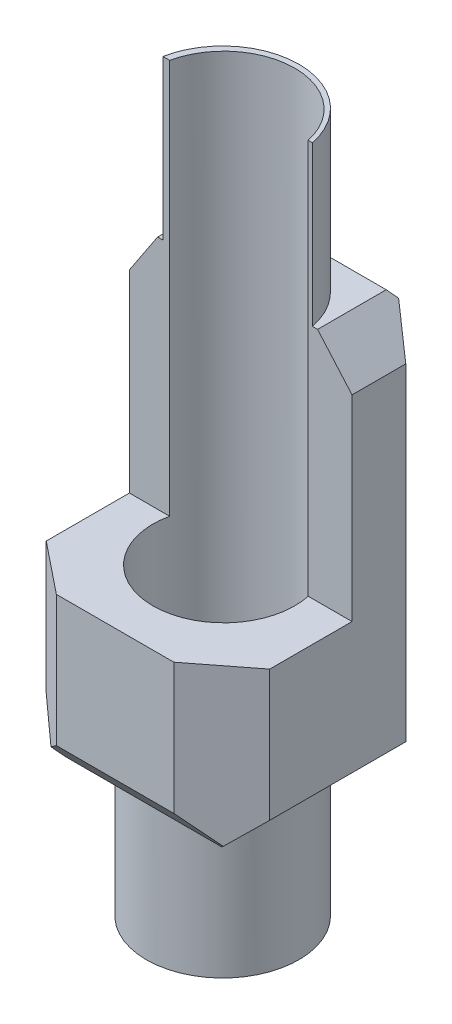
ISO-10303-21;
HEADER;
FILE_DESCRIPTION(('STEP AP214'),'2;1');
FILE_NAME('part.step','',(''),(''),'','','');
FILE_SCHEMA(('AUTOMOTIVE_DESIGN { 1 0 10303 214 1 1 1 1 }'));
ENDSEC;
DATA;
#1=APPLICATION_CONTEXT('core data for automotive mechanical design processes');
#2=APPLICATION_PROTOCOL_DEFINITION('international standard','automotive_design',2000,#1);
#3=PRODUCT_CONTEXT('',#1,'mechanical');
#4=PRODUCT('Part','Part','',(#3));
#5=PRODUCT_RELATED_PRODUCT_CATEGORY('part','',(#4));
#6=PRODUCT_DEFINITION_FORMATION('','',#4);
#7=PRODUCT_DEFINITION_CONTEXT('part definition',#1,'design');
#8=PRODUCT_DEFINITION('design','',#6,#7);
#9=PRODUCT_DEFINITION_SHAPE('','',#8);
#10=(LENGTH_UNIT() NAMED_UNIT(*) SI_UNIT(.MILLI.,.METRE.));
#11=(NAMED_UNIT(*) PLANE_ANGLE_UNIT() SI_UNIT($,.RADIAN.));
#12=(NAMED_UNIT(*) SI_UNIT($,.STERADIAN.) SOLID_ANGLE_UNIT());
#13=UNCERTAINTY_MEASURE_WITH_UNIT(LENGTH_MEASURE(1.E-05),#10,'distance_accuracy_value','');
#14=(GEOMETRIC_REPRESENTATION_CONTEXT(3) GLOBAL_UNCERTAINTY_ASSIGNED_CONTEXT((#13)) GLOBAL_UNIT_ASSIGNED_CONTEXT((#10,
#11,#12)) REPRESENTATION_CONTEXT('',''));
#15=CARTESIAN_POINT('',(0.,0.,0.));
#16=DIRECTION('',(0.,0.,1.));
#17=DIRECTION('',(1.,0.,0.));
#18=AXIS2_PLACEMENT_3D('',#15,#16,#17);
#19=CARTESIAN_POINT('',(0.,180.,0.));
#20=DIRECTION('',(-1.,0.,0.));
#21=DIRECTION('',(0.,0.,1.));
#22=AXIS2_PLACEMENT_3D('',#19,#20,#21);
#23=PLANE('',#22);
#24=DIRECTION('',(0.,0.,1.));
#25=VECTOR('',#24,1.);
#26=CARTESIAN_POINT('',(0.,162.25857257587,0.));
#27=LINE('',#26,#25);
#28=CARTESIAN_POINT('',(0.,162.25857257587,-79.942972796148));
#29=VERTEX_POINT('',#28);
#30=CARTESIAN_POINT('',(0.,162.25857257587,-55.8113966630778));
#31=VERTEX_POINT('',#30);
#32=EDGE_CURVE('E298',#29,#31,#27,.T.);
#33=ORIENTED_EDGE('',*,*,#32,.T.);
#34=DIRECTION('',(0.,-1.,0.));
#35=VECTOR('',#34,1.);
#36=CARTESIAN_POINT('',(0.,180.,-55.8113966630778));
#37=LINE('',#36,#35);
#38=CARTESIAN_POINT('',(0.,74.0838599725127,-55.8113966630778));
#39=VERTEX_POINT('',#38);
#40=EDGE_CURVE('E227',#31,#39,#37,.T.);
#41=ORIENTED_EDGE('',*,*,#40,.T.);
#42=DIRECTION('',(0.,0.,1.));
#43=VECTOR('',#42,1.);
#44=CARTESIAN_POINT('',(0.,74.0838599725127,0.));
#45=LINE('',#44,#43);
#46=CARTESIAN_POINT('',(0.,74.0838599725127,-18.835743686039));
#47=VERTEX_POINT('',#46);
#48=EDGE_CURVE('E211',#39,#47,#45,.T.);
#49=ORIENTED_EDGE('',*,*,#48,.T.);
#50=DIRECTION('',(0.,-1.,0.));
#51=VECTOR('',#50,1.);
#52=CARTESIAN_POINT('',(0.,180.,-18.835743686039));
#53=LINE('',#52,#51);
#54=CARTESIAN_POINT('',(0.,15.2573853040028,-18.835743686039));
#55=VERTEX_POINT('',#54);
#56=EDGE_CURVE('E263',#47,#55,#53,.T.);
#57=ORIENTED_EDGE('',*,*,#56,.T.);
#58=DIRECTION('',(0.,0.,1.));
#59=VECTOR('',#58,1.);
#60=CARTESIAN_POINT('',(0.,15.2573853040028,-400.));
#61=LINE('',#60,#59);
#62=CARTESIAN_POINT('',(0.,15.2573853040028,-79.942972796148));
#63=VERTEX_POINT('',#62);
#64=EDGE_CURVE('E284',#63,#55,#61,.T.);
#65=ORIENTED_EDGE('',*,*,#64,.F.);
#66=DIRECTION('',(0.,1.,0.));
#67=VECTOR('',#66,1.);
#68=CARTESIAN_POINT('',(0.,180.,-79.942972796148));
#69=LINE('',#68,#67);
#70=EDGE_CURVE('E248',#63,#29,#69,.T.);
#71=ORIENTED_EDGE('',*,*,#70,.T.);
#72=EDGE_LOOP('',(#33,#41,#49,#57,#65,#71));
#73=FACE_BOUND('',#72,.T.);
#74=ADVANCED_FACE('F33',(#73),#23,.F.);
#75=CARTESIAN_POINT('',(0.,180.,-100.));
#76=DIRECTION('',(0.,0.,1.));
#77=DIRECTION('',(1.,0.,0.));
#78=AXIS2_PLACEMENT_3D('',#75,#76,#77);
#79=PLANE('',#78);
#80=DIRECTION('',(-1.,0.,0.));
#81=VECTOR('',#80,1.);
#82=CARTESIAN_POINT('',(0.,11.2531638573118,-100.));
#83=LINE('',#82,#81);
#84=CARTESIAN_POINT('',(-26.8680350721203,11.2531638573118,-100.));
#85=VERTEX_POINT('',#84);
#86=CARTESIAN_POINT('',(-78.23623075056,11.2531638573118,-100.));
#87=VERTEX_POINT('',#86);
#88=EDGE_CURVE('E321',#85,#87,#83,.T.);
#89=ORIENTED_EDGE('',*,*,#88,.T.);
#90=DIRECTION('',(0.,1.,0.));
#91=VECTOR('',#90,1.);
#92=CARTESIAN_POINT('',(-78.23623075056,180.,-100.));
#93=LINE('',#92,#91);
#94=CARTESIAN_POINT('',(-78.23623075056,164.310416887307,-100.));
#95=VERTEX_POINT('',#94);
#96=EDGE_CURVE('E275',#87,#95,#93,.T.);
#97=ORIENTED_EDGE('',*,*,#96,.T.);
#98=DIRECTION('',(1.,0.,0.));
#99=VECTOR('',#98,1.);
#100=CARTESIAN_POINT('',(0.,164.310416887307,-100.));
#101=LINE('',#100,#99);
#102=CARTESIAN_POINT('',(-26.8680350721203,164.310416887307,-100.));
#103=VERTEX_POINT('',#102);
#104=EDGE_CURVE('E324',#95,#103,#101,.T.);
#105=ORIENTED_EDGE('',*,*,#104,.T.);
#106=DIRECTION('',(0.,-1.,0.));
#107=VECTOR('',#106,1.);
#108=CARTESIAN_POINT('',(-26.8680350721203,180.,-100.));
#109=LINE('',#108,#107);
#110=EDGE_CURVE('E244',#103,#85,#109,.T.);
#111=ORIENTED_EDGE('',*,*,#110,.T.);
#112=EDGE_LOOP('',(#89,#97,#105,#111));
#113=FACE_BOUND('',#112,.T.);
#114=ADVANCED_FACE('F425',(#113),#79,.F.);
#115=CARTESIAN_POINT('',(-100.,180.,0.));
#116=DIRECTION('',(1.,0.,0.));
#117=DIRECTION('',(0.,0.,-1.));
#118=AXIS2_PLACEMENT_3D('',#115,#116,#117);
#119=PLANE('',#118);
#120=DIRECTION('',(0.,0.,1.));
#121=VECTOR('',#120,1.);
#122=CARTESIAN_POINT('',(-100.,74.0838599725127,-55.8113966630778));
#123=LINE('',#122,#121);
#124=CARTESIAN_POINT('',(-100.,74.0838599725127,-55.8113966630778));
#125=VERTEX_POINT('',#124);
#126=CARTESIAN_POINT('',(-100.,74.0838599725127,-18.4618277268646));
#127=VERTEX_POINT('',#126);
#128=EDGE_CURVE('E190',#125,#127,#123,.T.);
#129=ORIENTED_EDGE('',*,*,#128,.F.);
#130=DIRECTION('',(0.,-1.,0.));
#131=VECTOR('',#130,1.);
#132=CARTESIAN_POINT('',(-100.,74.0838599725127,-55.8113966630778));
#133=LINE('',#132,#131);
#134=CARTESIAN_POINT('',(-100.,160.896793159201,-55.8113966630778));
#135=VERTEX_POINT('',#134);
#136=EDGE_CURVE('E181',#135,#125,#133,.T.);
#137=ORIENTED_EDGE('',*,*,#136,.F.);
#138=DIRECTION('',(0.,0.,-1.));
#139=VECTOR('',#138,1.);
#140=CARTESIAN_POINT('',(-100.,160.896793159201,0.));
#141=LINE('',#140,#139);
#142=CARTESIAN_POINT('',(-100.,160.896793159201,-80.507743362499));
#143=VERTEX_POINT('',#142);
#144=EDGE_CURVE('E309',#135,#143,#141,.T.);
#145=ORIENTED_EDGE('',*,*,#144,.T.);
#146=DIRECTION('',(0.,-1.,0.));
#147=VECTOR('',#146,1.);
#148=CARTESIAN_POINT('',(-100.,180.,-80.507743362499));
#149=LINE('',#148,#147);
#150=CARTESIAN_POINT('',(-100.,14.8474354345408,-80.507743362499));
#151=VERTEX_POINT('',#150);
#152=EDGE_CURVE('E272',#143,#151,#149,.T.);
#153=ORIENTED_EDGE('',*,*,#152,.T.);
#154=DIRECTION('',(0.,0.,1.));
#155=VECTOR('',#154,1.);
#156=CARTESIAN_POINT('',(-100.,14.8474354345408,0.));
#157=LINE('',#156,#155);
#158=CARTESIAN_POINT('',(-100.,14.8474354345408,-18.4618277268646));
#159=VERTEX_POINT('',#158);
#160=EDGE_CURVE('E311',#151,#159,#157,.T.);
#161=ORIENTED_EDGE('',*,*,#160,.T.);
#162=DIRECTION('',(0.,1.,0.));
#163=VECTOR('',#162,1.);
#164=CARTESIAN_POINT('',(-100.,180.,-18.4618277268646));
#165=LINE('',#164,#163);
#166=EDGE_CURVE('E200',#159,#127,#165,.T.);
#167=ORIENTED_EDGE('',*,*,#166,.T.);
#168=EDGE_LOOP('',(#129,#137,#145,#153,#161,#167));
#169=FACE_BOUND('',#168,.T.);
#170=ADVANCED_FACE('F198',(#169),#119,.F.);
#171=CARTESIAN_POINT('',(0.,180.,0.));
#172=DIRECTION('',(0.,0.,-1.));
#173=DIRECTION('',(-1.,0.,0.));
#174=AXIS2_PLACEMENT_3D('',#171,#172,#173);
#175=PLANE('',#174);
#176=DIRECTION('',(0.,1.,0.));
#177=VECTOR('',#176,1.);
#178=CARTESIAN_POINT('',(-24.2126205432622,180.,0.));
#179=LINE('',#178,#177);
#180=CARTESIAN_POINT('',(-24.2126205432622,15.2573853040028,0.));
#181=VERTEX_POINT('',#180);
#182=CARTESIAN_POINT('',(-24.2126205432622,74.0838599725127,0.));
#183=VERTEX_POINT('',#182);
#184=EDGE_CURVE('E260',#181,#183,#179,.T.);
#185=ORIENTED_EDGE('',*,*,#184,.T.);
#186=DIRECTION('',(-1.,0.,0.));
#187=VECTOR('',#186,1.);
#188=CARTESIAN_POINT('',(0.,74.0838599725127,0.));
#189=LINE('',#188,#187);
#190=CARTESIAN_POINT('',(-76.9899954986816,74.0838599725127,0.));
#191=VERTEX_POINT('',#190);
#192=EDGE_CURVE('E205',#183,#191,#189,.T.);
#193=ORIENTED_EDGE('',*,*,#192,.T.);
#194=DIRECTION('',(0.,-1.,0.));
#195=VECTOR('',#194,1.);
#196=CARTESIAN_POINT('',(-76.9899954986816,180.,0.));
#197=LINE('',#196,#195);
#198=CARTESIAN_POINT('',(-76.9899954986816,15.2573853040028,0.));
#199=VERTEX_POINT('',#198);
#200=EDGE_CURVE('E268',#191,#199,#197,.T.);
#201=ORIENTED_EDGE('',*,*,#200,.T.);
#202=DIRECTION('',(1.,0.,0.));
#203=VECTOR('',#202,1.);
#204=CARTESIAN_POINT('',(0.,15.2573853040028,0.));
#205=LINE('',#204,#203);
#206=EDGE_CURVE('E318',#199,#181,#205,.T.);
#207=ORIENTED_EDGE('',*,*,#206,.T.);
#208=EDGE_LOOP('',(#185,#193,#201,#207));
#209=FACE_BOUND('',#208,.T.);
#210=ADVANCED_FACE('F479',(#209),#175,.F.);
#211=CARTESIAN_POINT('',(0.,180.,0.));
#212=DIRECTION('',(0.,1.,0.));
#213=DIRECTION('',(0.,0.,1.));
#214=AXIS2_PLACEMENT_3D('',#211,#212,#213);
#215=PLANE('',#214);
#216=DIRECTION('',(-1.,0.,0.));
#217=VECTOR('',#216,1.);
#218=CARTESIAN_POINT('',(0.,180.,-55.8113966630778));
#219=LINE('',#218,#217);
#220=CARTESIAN_POINT('',(-15.4785584814981,180.,-55.8113966630778));
#221=VERTEX_POINT('',#220);
#222=CARTESIAN_POINT('',(-17.7880398883026,180.,-55.8113966630778));
#223=VERTEX_POINT('',#222);
#224=EDGE_CURVE('E221',#221,#223,#219,.T.);
#225=ORIENTED_EDGE('',*,*,#224,.F.);
#226=DIRECTION('',(0.,0.,1.));
#227=VECTOR('',#226,1.);
#228=CARTESIAN_POINT('',(-15.4785584814982,180.,0.));
#229=LINE('',#228,#227);
#230=CARTESIAN_POINT('',(-15.4785584814982,180.,-86.6502872632608));
#231=VERTEX_POINT('',#230);
#232=EDGE_CURVE('E295',#231,#221,#229,.T.);
#233=ORIENTED_EDGE('',*,*,#232,.F.);
#234=DIRECTION('',(1.,0.,0.));
#235=VECTOR('',#234,1.);
#236=CARTESIAN_POINT('',(0.,180.,-86.6502872632607));
#237=LINE('',#236,#235);
#238=CARTESIAN_POINT('',(-87.3310077399419,180.,-86.6502872632608));
#239=VERTEX_POINT('',#238);
#240=EDGE_CURVE('E339',#239,#231,#237,.T.);
#241=ORIENTED_EDGE('',*,*,#240,.F.);
#242=DIRECTION('',(0.,0.,-1.));
#243=VECTOR('',#242,1.);
#244=CARTESIAN_POINT('',(-87.3310077399419,180.,0.));
#245=LINE('',#244,#243);
#246=CARTESIAN_POINT('',(-87.3310077399419,180.,-55.8113966630778));
#247=VERTEX_POINT('',#246);
#248=EDGE_CURVE('E304',#247,#239,#245,.T.);
#249=ORIENTED_EDGE('',*,*,#248,.F.);
#250=CARTESIAN_POINT('',(-84.9665437781077,180.,-55.8113966630778));
#251=VERTEX_POINT('',#250);
#252=EDGE_CURVE('E224',#251,#247,#219,.T.);
#253=ORIENTED_EDGE('',*,*,#252,.F.);
#254=CARTESIAN_POINT('',(-51.3772918332052,180.,-49.0765363844359));
#255=DIRECTION('',(0.,1.,0.));
#256=DIRECTION('',(0.,0.,1.));
#257=AXIS2_PLACEMENT_3D('',#254,#255,#256);
#258=CIRCLE('',#257,34.2577901971357);
#259=EDGE_CURVE('E327',#251,#223,#258,.F.);
#260=ORIENTED_EDGE('',*,*,#259,.T.);
#261=EDGE_LOOP('',(#225,#233,#241,#249,#253,#260));
#262=FACE_BOUND('',#261,.T.);
#263=ADVANCED_FACE('F381',(#262),#215,.T.);
#264=CARTESIAN_POINT('',(0.,0.,0.));
#265=DIRECTION('',(0.,1.,0.));
#266=DIRECTION('',(0.,0.,1.));
#267=AXIS2_PLACEMENT_3D('',#264,#265,#266);
#268=PLANE('',#267);
#269=DIRECTION('',(1.,0.,0.));
#270=VECTOR('',#269,1.);
#271=CARTESIAN_POINT('',(0.,0.,-86.7744382892866));
#272=LINE('',#271,#270);
#273=CARTESIAN_POINT('',(-85.6232873351068,0.,-86.7744382892867));
#274=VERTEX_POINT('',#273);
#275=CARTESIAN_POINT('',(-15.6949887514202,0.,-86.7744382892866));
#276=VERTEX_POINT('',#275);
#277=EDGE_CURVE('E336',#274,#276,#272,.T.);
#278=ORIENTED_EDGE('',*,*,#277,.T.);
#279=DIRECTION('',(0.,0.,1.));
#280=VECTOR('',#279,1.);
#281=CARTESIAN_POINT('',(-15.6949887514202,0.,-400.));
#282=LINE('',#281,#280);
#283=CARTESIAN_POINT('',(-15.6949887514202,0.,-12.9819708694115));
#284=VERTEX_POINT('',#283);
#285=EDGE_CURVE('E285',#276,#284,#282,.T.);
#286=ORIENTED_EDGE('',*,*,#285,.T.);
#287=DIRECTION('',(-1.,0.,0.));
#288=VECTOR('',#287,1.);
#289=CARTESIAN_POINT('',(0.,0.,-12.9819708694114));
#290=LINE('',#289,#288);
#291=CARTESIAN_POINT('',(-85.6232873351069,0.,-12.9819708694114));
#292=VERTEX_POINT('',#291);
#293=EDGE_CURVE('E333',#284,#292,#290,.T.);
#294=ORIENTED_EDGE('',*,*,#293,.T.);
#295=DIRECTION('',(0.,0.,1.));
#296=VECTOR('',#295,1.);
#297=CARTESIAN_POINT('',(-85.6232873351068,0.,-400.));
#298=LINE('',#297,#296);
#299=CARTESIAN_POINT('',(-85.6232873351068,0.,-48.1776585981388));
#300=VERTEX_POINT('',#299);
#301=EDGE_CURVE('E288',#300,#292,#298,.T.);
#302=ORIENTED_EDGE('',*,*,#301,.F.);
#303=CARTESIAN_POINT('',(-51.3772918332052,0.,-49.0765363844359));
#304=DIRECTION('',(0.,1.,0.));
#305=DIRECTION('',(0.,0.,1.));
#306=AXIS2_PLACEMENT_3D('',#303,#304,#305);
#307=CIRCLE('',#306,34.2577901971357);
#308=CARTESIAN_POINT('',(-85.6232873351068,0.,-49.9754141707329));
#309=VERTEX_POINT('',#308);
#310=EDGE_CURVE('E330',#309,#300,#307,.F.);
#311=ORIENTED_EDGE('',*,*,#310,.F.);
#312=EDGE_CURVE('E294',#274,#309,#298,.T.);
#313=ORIENTED_EDGE('',*,*,#312,.F.);
#314=EDGE_LOOP('',(#278,#286,#294,#302,#311,#313));
#315=FACE_BOUND('',#314,.T.);
#316=ADVANCED_FACE('F402',(#315),#268,.F.);
#317=CARTESIAN_POINT('',(-51.3772918332052,530.,-49.0765363844359));
#318=DIRECTION('',(0.,-1.,0.));
#319=DIRECTION('',(0.,0.,-1.));
#320=AXIS2_PLACEMENT_3D('',#317,#318,#319);
#321=CYLINDRICAL_SURFACE('',#320,34.2577901971357);
#322=CARTESIAN_POINT('',(-51.3772918332052,-62.6813888831705,-49.0765363844359));
#323=DIRECTION('',(0.,1.,0.));
#324=DIRECTION('',(0.,0.,1.));
#325=AXIS2_PLACEMENT_3D('',#322,#323,#324);
#326=CIRCLE('',#325,34.2577901971357);
#327=CARTESIAN_POINT('',(-51.3772918332052,-62.6813888831705,-14.8187461873002));
#328=VERTEX_POINT('',#327);
#329=EDGE_CURVE('E245',#328,#328,#326,.T.);
#330=ORIENTED_EDGE('',*,*,#329,.T.);
#331=EDGE_LOOP('',(#330));
#332=FACE_BOUND('',#331,.T.);
#333=ORIENTED_EDGE('',*,*,#310,.T.);
#334=CARTESIAN_POINT('',(-51.3772918332052,86.1655593743765,-49.0765363844359));
#335=DIRECTION('',(0.929293452580676,-0.369342224760028,0.));
#336=DIRECTION('',(-0.369342224760028,-0.929293452580676,0.));
#337=AXIS2_PLACEMENT_3D('',#334,#335,#336);
#338=ELLIPSE('',#337,92.7535166589576,34.2577901971357);
#339=EDGE_CURVE('E347',#300,#309,#338,.T.);
#340=ORIENTED_EDGE('',*,*,#339,.T.);
#341=EDGE_LOOP('',(#333,#340));
#342=FACE_BOUND('',#341,.T.);
#343=ADVANCED_FACE('F410',(#332,#342),#321,.T.);
#344=CARTESIAN_POINT('',(-51.3772918332052,251.428834106385,-49.0765363844359));
#345=DIRECTION('',(0.,-1.,0.));
#346=DIRECTION('',(0.,0.,-1.));
#347=AXIS2_PLACEMENT_3D('',#344,#345,#346);
#348=CIRCLE('',#347,34.2577901971357);
#349=CARTESIAN_POINT('',(-84.9665437781077,251.428834106385,-55.8113966630778));
#350=VERTEX_POINT('',#349);
#351=CARTESIAN_POINT('',(-17.7880398883026,251.428834106385,-55.8113966630778));
#352=VERTEX_POINT('',#351);
#353=EDGE_CURVE('E240',#350,#352,#348,.T.);
#354=ORIENTED_EDGE('',*,*,#353,.T.);
#355=DIRECTION('',(0.,-1.,0.));
#356=VECTOR('',#355,1.);
#357=CARTESIAN_POINT('',(-17.7880398883026,530.,-55.8113966630778));
#358=LINE('',#357,#356);
#359=EDGE_CURVE('E217',#352,#223,#358,.T.);
#360=ORIENTED_EDGE('',*,*,#359,.T.);
#361=ORIENTED_EDGE('',*,*,#259,.F.);
#362=DIRECTION('',(0.,-1.,0.));
#363=VECTOR('',#362,1.);
#364=CARTESIAN_POINT('',(-84.9665437781077,530.,-55.8113966630778));
#365=LINE('',#364,#363);
#366=EDGE_CURVE('E230',#251,#350,#365,.F.);
#367=ORIENTED_EDGE('',*,*,#366,.T.);
#368=EDGE_LOOP('',(#354,#360,#361,#367));
#369=FACE_BOUND('',#368,.T.);
#370=ADVANCED_FACE('F378',(#369),#321,.T.);
#371=CARTESIAN_POINT('',(-400.,0.,-12.9819708694114));
#372=DIRECTION('',(0.,0.648030679802751,-0.761614231769854));
#373=DIRECTION('',(0.,0.761614231769854,0.648030679802751));
#374=AXIS2_PLACEMENT_3D('',#371,#372,#373);
#375=PLANE('',#374);
#376=DIRECTION('',(0.61672298954482,0.599527685323787,0.51011695590051));
#377=VECTOR('',#376,1.);
#378=CARTESIAN_POINT('',(-161.864341339676,-142.093898084117,-133.884655627931));
#379=LINE('',#378,#377);
#380=CARTESIAN_POINT('',(-11.7351397334046,3.84944157466014,-9.70661684314665));
#381=VERTEX_POINT('',#380);
#382=EDGE_CURVE('E315',#284,#381,#379,.T.);
#383=ORIENTED_EDGE('',*,*,#382,.T.);
#384=DIRECTION('',(-0.640041580283072,0.585178886954522,0.49790806959861));
#385=VECTOR('',#384,1.);
#386=CARTESIAN_POINT('',(-168.303530456469,146.997198592356,112.092759301453));
#387=LINE('',#386,#385);
#388=EDGE_CURVE('E257',#381,#181,#387,.T.);
#389=ORIENTED_EDGE('',*,*,#388,.T.);
#390=ORIENTED_EDGE('',*,*,#206,.F.);
#391=DIRECTION('',(-0.628329778342481,-0.592495582556801,-0.504133587751069));
#392=VECTOR('',#391,1.);
#393=CARTESIAN_POINT('',(-214.306055792962,-114.227420195886,-110.174052731693));
#394=LINE('',#393,#392);
#395=CARTESIAN_POINT('',(-89.2252600270588,3.71990859296577,-9.81683188730251));
#396=VERTEX_POINT('',#395);
#397=EDGE_CURVE('E265',#199,#396,#394,.T.);
#398=ORIENTED_EDGE('',*,*,#397,.T.);
#399=DIRECTION('',(0.593525479967305,-0.612958709544806,-0.521544940559053));
#400=VECTOR('',#399,1.);
#401=CARTESIAN_POINT('',(-196.369556391918,114.372326815193,84.3334069228837));
#402=LINE('',#401,#400);
#403=EDGE_CURVE('E313',#396,#292,#402,.T.);
#404=ORIENTED_EDGE('',*,*,#403,.T.);
#405=ORIENTED_EDGE('',*,*,#293,.F.);
#406=EDGE_LOOP('',(#383,#389,#390,#398,#404,#405));
#407=FACE_BOUND('',#406,.T.);
#408=ADVANCED_FACE('F477',(#407),#375,.F.);
#409=CARTESIAN_POINT('',(-400.,-1.44810398413053,-85.072517936176));
#410=DIRECTION('',(0.,0.761614231769854,0.648030679802751));
#411=DIRECTION('',(0.,-0.648030679802751,0.761614231769854));
#412=AXIS2_PLACEMENT_3D('',#409,#410,#411);
#413=PLANE('',#412);
#414=DIRECTION('',(-0.531512068777104,0.548914853332077,-0.645125882704847));
#415=VECTOR('',#414,1.);
#416=CARTESIAN_POINT('',(-173.430238872661,90.6819294539596,-193.350639369007));
#417=LINE('',#416,#415);
#418=CARTESIAN_POINT('',(-88.756666543567,3.23597240717974,-90.5775956331223));
#419=VERTEX_POINT('',#418);
#420=EDGE_CURVE('E342',#274,#419,#417,.T.);
#421=ORIENTED_EDGE('',*,*,#420,.T.);
#422=DIRECTION('',(0.647811274519912,0.49367033016184,-0.580198377904305));
#423=VECTOR('',#422,1.);
#424=CARTESIAN_POINT('',(-222.939997158503,-99.0196253762684,29.6008480382685));
#425=LINE('',#424,#423);
#426=EDGE_CURVE('E55',#419,#87,#425,.T.);
#427=ORIENTED_EDGE('',*,*,#426,.T.);
#428=ORIENTED_EDGE('',*,*,#88,.F.);
#429=DIRECTION('',(0.71415681894842,-0.453612235752694,0.533119102569883));
#430=VECTOR('',#429,1.);
#431=CARTESIAN_POINT('',(-207.374856665364,125.905997435364,-234.7486044833));
#432=LINE('',#431,#430);
#433=CARTESIAN_POINT('',(-13.109045681771,2.51384250175289,-89.7288944368655));
#434=VERTEX_POINT('',#433);
#435=EDGE_CURVE('E241',#85,#434,#432,.T.);
#436=ORIENTED_EDGE('',*,*,#435,.T.);
#437=DIRECTION('',(-0.554671653885714,-0.539206448286052,0.633715837345437));
#438=VECTOR('',#437,1.);
#439=CARTESIAN_POINT('',(-134.961850638957,-115.941495380351,49.48869814313));
#440=LINE('',#439,#438);
#441=EDGE_CURVE('E345',#434,#276,#440,.T.);
#442=ORIENTED_EDGE('',*,*,#441,.T.);
#443=ORIENTED_EDGE('',*,*,#277,.F.);
#444=EDGE_LOOP('',(#421,#427,#428,#436,#442,#443));
#445=FACE_BOUND('',#444,.T.);
#446=ADVANCED_FACE('F397',(#445),#413,.F.);
#447=CARTESIAN_POINT('',(-400.,181.854312783962,-85.072517936176));
#448=DIRECTION('',(0.,-0.648030679802751,0.761614231769854));
#449=DIRECTION('',(0.,-0.761614231769854,-0.648030679802751));
#450=AXIS2_PLACEMENT_3D('',#447,#448,#449);
#451=PLANE('',#450);
#452=ORIENTED_EDGE('',*,*,#104,.F.);
#453=DIRECTION('',(-0.586196421620691,0.617036215494435,0.52501434651579));
#454=VECTOR('',#453,1.);
#455=CARTESIAN_POINT('',(-199.742515919054,292.209147745934,8.82451777669856));
#456=LINE('',#455,#454);
#457=CARTESIAN_POINT('',(-89.7197502262504,176.398084325205,-89.7150302341283));
#458=VERTEX_POINT('',#457);
#459=EDGE_CURVE('E281',#95,#458,#456,.T.);
#460=ORIENTED_EDGE('',*,*,#459,.T.);
#461=DIRECTION('',(0.450846295048029,0.679818082679197,0.578433222337588));
#462=VECTOR('',#461,1.);
#463=CARTESIAN_POINT('',(-149.905059314496,85.6463982645104,-166.932438152694));
#464=LINE('',#463,#462);
#465=EDGE_CURVE('E306',#458,#239,#464,.T.);
#466=ORIENTED_EDGE('',*,*,#465,.T.);
#467=ORIENTED_EDGE('',*,*,#240,.T.);
#468=DIRECTION('',(0.553434352005852,-0.634343010808712,-0.539740088059059));
#469=VECTOR('',#468,1.);
#470=CARTESIAN_POINT('',(-134.375755077368,316.279226961578,29.3048989806743));
#471=LINE('',#470,#469);
#472=CARTESIAN_POINT('',(-12.6631489460901,176.772995107952,-89.3960318760697));
#473=VERTEX_POINT('',#472);
#474=EDGE_CURVE('E301',#231,#473,#471,.T.);
#475=ORIENTED_EDGE('',*,*,#474,.T.);
#476=DIRECTION('',(-0.655544261905661,-0.575138129838513,-0.489364743609938));
#477=VECTOR('',#476,1.);
#478=CARTESIAN_POINT('',(-175.813834897368,33.6336438044814,-211.188255894991));
#479=LINE('',#478,#477);
#480=EDGE_CURVE('E254',#473,#103,#479,.T.);
#481=ORIENTED_EDGE('',*,*,#480,.T.);
#482=EDGE_LOOP('',(#452,#460,#466,#467,#475,#481));
#483=FACE_BOUND('',#482,.T.);
#484=ADVANCED_FACE('F468',(#483),#451,.F.);
#485=CARTESIAN_POINT('',(-15.6949887514202,180.248071028759,-400.));
#486=DIRECTION('',(-0.753527099389569,-0.657416846822123,0.));
#487=DIRECTION('',(0.657416846822123,-0.753527099389569,0.));
#488=AXIS2_PLACEMENT_3D('',#485,#486,#487);
#489=PLANE('',#488);
#490=ORIENTED_EDGE('',*,*,#232,.T.);
#491=DIRECTION('',(0.657416846822123,-0.753527099389569,0.));
#492=VECTOR('',#491,1.);
#493=CARTESIAN_POINT('',(-15.6949887514202,180.248071028759,-55.8113966630778));
#494=LINE('',#493,#492);
#495=EDGE_CURVE('E223',#221,#31,#494,.T.);
#496=ORIENTED_EDGE('',*,*,#495,.T.);
#497=ORIENTED_EDGE('',*,*,#32,.F.);
#498=DIRECTION('',(-0.590175998555204,0.676456057477596,-0.440567240079464));
#499=VECTOR('',#498,1.);
#500=CARTESIAN_POINT('',(-95.8673346312649,272.14111504508,-151.508077333892));
#501=LINE('',#500,#499);
#502=EDGE_CURVE('E251',#29,#473,#501,.T.);
#503=ORIENTED_EDGE('',*,*,#502,.T.);
#504=ORIENTED_EDGE('',*,*,#474,.F.);
#505=EDGE_LOOP('',(#490,#496,#497,#503,#504));
#506=FACE_BOUND('',#505,.T.);
#507=ADVANCED_FACE('F421',(#506),#489,.F.);
#508=CARTESIAN_POINT('',(-87.166490338781,180.248071028759,-400.));
#509=DIRECTION('',(0.833386414729428,-0.552690766834791,0.));
#510=DIRECTION('',(0.552690766834791,0.833386414729428,0.));
#511=AXIS2_PLACEMENT_3D('',#508,#509,#510);
#512=PLANE('',#511);
#513=ORIENTED_EDGE('',*,*,#144,.F.);
#514=DIRECTION('',(0.552690766834791,0.833386414729428,0.));
#515=VECTOR('',#514,1.);
#516=CARTESIAN_POINT('',(-87.166490338781,180.248071028759,-55.8113966630778));
#517=LINE('',#516,#515);
#518=EDGE_CURVE('E186',#135,#247,#517,.T.);
#519=ORIENTED_EDGE('',*,*,#518,.T.);
#520=ORIENTED_EDGE('',*,*,#248,.T.);
#521=ORIENTED_EDGE('',*,*,#465,.F.);
#522=DIRECTION('',(-0.495327209718188,-0.746889566816963,0.443629271230791));
#523=VECTOR('',#522,1.);
#524=CARTESIAN_POINT('',(-19.4864586420873,282.300832444514,-152.617982767967));
#525=LINE('',#524,#523);
#526=EDGE_CURVE('E278',#458,#143,#525,.T.);
#527=ORIENTED_EDGE('',*,*,#526,.T.);
#528=EDGE_LOOP('',(#513,#519,#520,#521,#527));
#529=FACE_BOUND('',#528,.T.);
#530=ADVANCED_FACE('F386',(#529),#512,.F.);
#531=CARTESIAN_POINT('',(-93.5263452614059,-19.8847017587749,-400.));
#532=DIRECTION('',(0.929293452580676,-0.369342224760028,0.));
#533=DIRECTION('',(0.369342224760028,0.929293452580676,0.));
#534=AXIS2_PLACEMENT_3D('',#531,#532,#533);
#535=PLANE('',#534);
#536=EDGE_CURVE('E293',#309,#300,#298,.T.);
#537=ORIENTED_EDGE('',*,*,#536,.F.);
#538=ORIENTED_EDGE('',*,*,#339,.F.);
#539=EDGE_LOOP('',(#537,#538));
#540=FACE_BOUND('',#539,.T.);
#541=ADVANCED_FACE('F411',(#540),#535,.F.);
#542=CARTESIAN_POINT('',(-85.6232873351068,0.,-400.));
#543=DIRECTION('',(0.718403190633828,0.695626951524404,0.));
#544=DIRECTION('',(-0.695626951524404,0.718403190633828,0.));
#545=AXIS2_PLACEMENT_3D('',#542,#543,#544);
#546=PLANE('',#545);
#547=ORIENTED_EDGE('',*,*,#160,.F.);
#548=DIRECTION('',(0.590414359571925,-0.609745724749451,-0.528792052853521));
#549=VECTOR('',#548,1.);
#550=CARTESIAN_POINT('',(10.1042154435278,-98.861815628153,-179.120240108721));
#551=LINE('',#550,#549);
#552=EDGE_CURVE('E359',#151,#419,#551,.T.);
#553=ORIENTED_EDGE('',*,*,#552,.T.);
#554=ORIENTED_EDGE('',*,*,#420,.F.);
#555=ORIENTED_EDGE('',*,*,#312,.T.);
#556=ORIENTED_EDGE('',*,*,#536,.T.);
#557=ORIENTED_EDGE('',*,*,#301,.T.);
#558=ORIENTED_EDGE('',*,*,#403,.F.);
#559=DIRECTION('',(-0.60742264461239,0.627310895583479,-0.487358975596371));
#560=VECTOR('',#559,1.);
#561=CARTESIAN_POINT('',(-201.985869600553,120.172529524189,-100.289084867645));
#562=LINE('',#561,#560);
#563=EDGE_CURVE('E356',#396,#159,#562,.T.);
#564=ORIENTED_EDGE('',*,*,#563,.T.);
#565=EDGE_LOOP('',(#547,#553,#554,#555,#556,#557,#558,#564));
#566=FACE_BOUND('',#565,.T.);
#567=ADVANCED_FACE('F392',(#566),#546,.F.);
#568=CARTESIAN_POINT('',(-15.6949887514202,0.,-400.));
#569=DIRECTION('',(-0.697040073938311,0.717032171749687,0.));
#570=DIRECTION('',(-0.717032171749687,-0.697040073938311,0.));
#571=AXIS2_PLACEMENT_3D('',#568,#569,#570);
#572=PLANE('',#571);
#573=ORIENTED_EDGE('',*,*,#64,.T.);
#574=DIRECTION('',(-0.626200927331214,-0.608741361802611,0.487140999137037));
#575=VECTOR('',#574,1.);
#576=CARTESIAN_POINT('',(104.302981271785,116.652218955974,-99.9762471443389));
#577=LINE('',#576,#575);
#578=EDGE_CURVE('E353',#55,#381,#577,.T.);
#579=ORIENTED_EDGE('',*,*,#578,.T.);
#580=ORIENTED_EDGE('',*,*,#382,.F.);
#581=ORIENTED_EDGE('',*,*,#285,.F.);
#582=ORIENTED_EDGE('',*,*,#441,.F.);
#583=DIRECTION('',(0.63216753808039,0.614541613118557,0.471913985322559));
#584=VECTOR('',#583,1.);
#585=CARTESIAN_POINT('',(-107.681868244315,-89.4221261043572,-160.32764383519));
#586=LINE('',#585,#584);
#587=EDGE_CURVE('E350',#434,#63,#586,.T.);
#588=ORIENTED_EDGE('',*,*,#587,.T.);
#589=EDGE_LOOP('',(#573,#579,#580,#581,#582,#588));
#590=FACE_BOUND('',#589,.T.);
#591=ADVANCED_FACE('F418',(#590),#572,.F.);
#592=CARTESIAN_POINT('',(-31.7243853522426,-220.,-103.625272537362));
#593=DIRECTION('',(-0.598204225918444,0.,0.801343686624731));
#594=DIRECTION('',(0.801343686624731,0.,0.598204225918444));
#595=AXIS2_PLACEMENT_3D('',#592,#593,#594);
#596=PLANE('',#595);
#597=ORIENTED_EDGE('',*,*,#502,.F.);
#598=ORIENTED_EDGE('',*,*,#70,.F.);
#599=ORIENTED_EDGE('',*,*,#587,.F.);
#600=ORIENTED_EDGE('',*,*,#435,.F.);
#601=ORIENTED_EDGE('',*,*,#110,.F.);
#602=ORIENTED_EDGE('',*,*,#480,.F.);
#603=EDGE_LOOP('',(#597,#598,#599,#600,#601,#602));
#604=FACE_BOUND('',#603,.T.);
#605=ADVANCED_FACE('F452',(#604),#596,.F.);
#606=CARTESIAN_POINT('',(-38.5315768457559,-220.,11.1391573780071));
#607=DIRECTION('',(-0.614015874090284,0.,-0.789293675614561));
#608=DIRECTION('',(-0.789293675614561,0.,0.614015874090284));
#609=AXIS2_PLACEMENT_3D('',#606,#607,#608);
#610=PLANE('',#609);
#611=ORIENTED_EDGE('',*,*,#56,.F.);
#612=DIRECTION('',(-0.789293675614561,0.,0.614015874090284));
#613=VECTOR('',#612,1.);
#614=CARTESIAN_POINT('',(-38.5315768457559,74.0838599725127,11.1391573780071));
#615=LINE('',#614,#613);
#616=EDGE_CURVE('E208',#47,#183,#615,.T.);
#617=ORIENTED_EDGE('',*,*,#616,.T.);
#618=ORIENTED_EDGE('',*,*,#184,.F.);
#619=ORIENTED_EDGE('',*,*,#388,.F.);
#620=ORIENTED_EDGE('',*,*,#578,.F.);
#621=EDGE_LOOP('',(#611,#617,#618,#619,#620));
#622=FACE_BOUND('',#621,.T.);
#623=ADVANCED_FACE('F455',(#622),#610,.F.);
#624=CARTESIAN_POINT('',(-112.386997555001,-220.,-28.4004009635807));
#625=DIRECTION('',(0.625806910437033,0.,-0.779978019465456));
#626=DIRECTION('',(-0.779978019465456,0.,-0.625806910437033));
#627=AXIS2_PLACEMENT_3D('',#624,#625,#626);
#628=PLANE('',#627);
#629=ORIENTED_EDGE('',*,*,#200,.F.);
#630=DIRECTION('',(-0.779978019465456,0.,-0.625806910437033));
#631=VECTOR('',#630,1.);
#632=CARTESIAN_POINT('',(-112.386997555001,74.0838599725127,-28.4004009635807));
#633=LINE('',#632,#631);
#634=EDGE_CURVE('E203',#191,#127,#633,.T.);
#635=ORIENTED_EDGE('',*,*,#634,.T.);
#636=ORIENTED_EDGE('',*,*,#166,.F.);
#637=ORIENTED_EDGE('',*,*,#563,.F.);
#638=ORIENTED_EDGE('',*,*,#397,.F.);
#639=EDGE_LOOP('',(#629,#635,#636,#637,#638));
#640=FACE_BOUND('',#639,.T.);
#641=ADVANCED_FACE('F459',(#640),#628,.F.);
#642=CARTESIAN_POINT('',(-66.4286941720711,-220.,-110.575168786561));
#643=DIRECTION('',(0.66716375547024,0.,0.744911084215322));
#644=DIRECTION('',(0.744911084215322,0.,-0.66716375547024));
#645=AXIS2_PLACEMENT_3D('',#642,#643,#644);
#646=PLANE('',#645);
#647=ORIENTED_EDGE('',*,*,#96,.F.);
#648=ORIENTED_EDGE('',*,*,#426,.F.);
#649=ORIENTED_EDGE('',*,*,#552,.F.);
#650=ORIENTED_EDGE('',*,*,#152,.F.);
#651=ORIENTED_EDGE('',*,*,#526,.F.);
#652=ORIENTED_EDGE('',*,*,#459,.F.);
#653=EDGE_LOOP('',(#647,#648,#649,#650,#651,#652));
#654=FACE_BOUND('',#653,.T.);
#655=ADVANCED_FACE('F390',(#654),#646,.F.);
#656=CARTESIAN_POINT('',(-146.202949733734,-62.6813888831705,-400.));
#657=DIRECTION('',(0.,1.,0.));
#658=DIRECTION('',(0.,0.,1.));
#659=AXIS2_PLACEMENT_3D('',#656,#657,#658);
#660=PLANE('',#659);
#661=CARTESIAN_POINT('',(-50.8089931565134,-62.6813888831705,-49.0320363736778));
#662=DIRECTION('',(0.,1.,0.));
#663=DIRECTION('',(0.,0.,1.));
#664=AXIS2_PLACEMENT_3D('',#661,#662,#663);
#665=CIRCLE('',#664,31.8472934226778);
#666=CARTESIAN_POINT('',(-50.8089931565134,-62.6813888831705,-17.184742951));
#667=VERTEX_POINT('',#666);
#668=EDGE_CURVE('E237',#667,#667,#665,.T.);
#669=ORIENTED_EDGE('',*,*,#668,.T.);
#670=EDGE_LOOP('',(#669));
#671=FACE_BOUND('',#670,.T.);
#672=ORIENTED_EDGE('',*,*,#329,.F.);
#673=EDGE_LOOP('',(#672));
#674=FACE_BOUND('',#673,.T.);
#675=ADVANCED_FACE('F449',(#671,#674),#660,.F.);
#676=CARTESIAN_POINT('',(-127.196525587436,251.428834106385,-400.));
#677=DIRECTION('',(0.,-1.,0.));
#678=DIRECTION('',(0.,0.,-1.));
#679=AXIS2_PLACEMENT_3D('',#676,#677,#678);
#680=PLANE('',#679);
#681=ORIENTED_EDGE('',*,*,#353,.F.);
#682=DIRECTION('',(1.,0.,0.));
#683=VECTOR('',#682,1.);
#684=CARTESIAN_POINT('',(-127.196525587436,251.428834106385,-55.8113966630778));
#685=LINE('',#684,#683);
#686=CARTESIAN_POINT('',(-81.9263576402972,251.428834106385,-55.8113966630778));
#687=VERTEX_POINT('',#686);
#688=EDGE_CURVE('E218',#350,#687,#685,.T.);
#689=ORIENTED_EDGE('',*,*,#688,.T.);
#690=CARTESIAN_POINT('',(-50.8089931565134,251.428834106385,-49.0320363736778));
#691=DIRECTION('',(0.,1.,0.));
#692=DIRECTION('',(0.,0.,1.));
#693=AXIS2_PLACEMENT_3D('',#690,#691,#692);
#694=CIRCLE('',#693,31.8472934226778);
#695=CARTESIAN_POINT('',(-19.6916286727297,251.428834106385,-55.8113966630778));
#696=VERTEX_POINT('',#695);
#697=EDGE_CURVE('E234',#696,#687,#694,.T.);
#698=ORIENTED_EDGE('',*,*,#697,.F.);
#699=EDGE_CURVE('E214',#696,#352,#685,.T.);
#700=ORIENTED_EDGE('',*,*,#699,.T.);
#701=EDGE_LOOP('',(#681,#689,#698,#700));
#702=FACE_BOUND('',#701,.T.);
#703=ADVANCED_FACE('F374',(#702),#680,.F.);
#704=CARTESIAN_POINT('',(-50.8089931565134,-148.571165893615,-49.0320363736778));
#705=DIRECTION('',(0.,1.,0.));
#706=DIRECTION('',(0.,0.,1.));
#707=AXIS2_PLACEMENT_3D('',#704,#705,#706);
#708=CYLINDRICAL_SURFACE('',#707,31.8472934226778);
#709=ORIENTED_EDGE('',*,*,#697,.T.);
#710=DIRECTION('',(0.,1.,0.));
#711=VECTOR('',#710,1.);
#712=CARTESIAN_POINT('',(-81.9263576402972,-148.571165893615,-55.8113966630778));
#713=LINE('',#712,#711);
#714=CARTESIAN_POINT('',(-81.9263576402972,74.0838599725127,-55.8113966630778));
#715=VERTEX_POINT('',#714);
#716=EDGE_CURVE('E11',#687,#715,#713,.F.);
#717=ORIENTED_EDGE('',*,*,#716,.T.);
#718=CARTESIAN_POINT('',(-50.8089931565134,74.0838599725127,-49.0320363736778));
#719=DIRECTION('',(0.,-1.,0.));
#720=DIRECTION('',(0.,0.,-1.));
#721=AXIS2_PLACEMENT_3D('',#718,#719,#720);
#722=CIRCLE('',#721,31.8472934226778);
#723=CARTESIAN_POINT('',(-19.6916286727297,74.0838599725127,-55.8113966630778));
#724=VERTEX_POINT('',#723);
#725=EDGE_CURVE('E195',#715,#724,#722,.F.);
#726=ORIENTED_EDGE('',*,*,#725,.T.);
#727=DIRECTION('',(0.,1.,0.));
#728=VECTOR('',#727,1.);
#729=CARTESIAN_POINT('',(-19.6916286727297,-148.571165893615,-55.8113966630778));
#730=LINE('',#729,#728);
#731=EDGE_CURVE('E40',#724,#696,#730,.T.);
#732=ORIENTED_EDGE('',*,*,#731,.T.);
#733=EDGE_LOOP('',(#709,#717,#726,#732));
#734=FACE_BOUND('',#733,.T.);
#735=ORIENTED_EDGE('',*,*,#668,.F.);
#736=EDGE_LOOP('',(#735));
#737=FACE_BOUND('',#736,.T.);
#738=ADVANCED_FACE('F368',(#734,#737),#708,.F.);
#739=CARTESIAN_POINT('',(300.,74.0838599725127,-55.8113966630778));
#740=DIRECTION('',(0.,0.,-1.));
#741=DIRECTION('',(-1.,0.,0.));
#742=AXIS2_PLACEMENT_3D('',#739,#740,#741);
#743=PLANE('',#742);
#744=ORIENTED_EDGE('',*,*,#136,.T.);
#745=DIRECTION('',(-1.,0.,0.));
#746=VECTOR('',#745,1.);
#747=CARTESIAN_POINT('',(300.,74.0838599725127,-55.8113966630778));
#748=LINE('',#747,#746);
#749=EDGE_CURVE('E184',#715,#125,#748,.T.);
#750=ORIENTED_EDGE('',*,*,#749,.F.);
#751=ORIENTED_EDGE('',*,*,#716,.F.);
#752=ORIENTED_EDGE('',*,*,#688,.F.);
#753=ORIENTED_EDGE('',*,*,#366,.F.);
#754=ORIENTED_EDGE('',*,*,#252,.T.);
#755=ORIENTED_EDGE('',*,*,#518,.F.);
#756=EDGE_LOOP('',(#744,#750,#751,#752,#753,#754,#755));
#757=FACE_BOUND('',#756,.T.);
#758=ADVANCED_FACE('F183',(#757),#743,.F.);
#759=ORIENTED_EDGE('',*,*,#495,.F.);
#760=ORIENTED_EDGE('',*,*,#224,.T.);
#761=ORIENTED_EDGE('',*,*,#359,.F.);
#762=ORIENTED_EDGE('',*,*,#699,.F.);
#763=ORIENTED_EDGE('',*,*,#731,.F.);
#764=EDGE_CURVE('E47',#39,#724,#748,.T.);
#765=ORIENTED_EDGE('',*,*,#764,.F.);
#766=ORIENTED_EDGE('',*,*,#40,.F.);
#767=EDGE_LOOP('',(#759,#760,#761,#762,#763,#765,#766));
#768=FACE_BOUND('',#767,.T.);
#769=ADVANCED_FACE('F436',(#768),#743,.F.);
#770=CARTESIAN_POINT('',(300.,74.0838599725127,-55.8113966630778));
#771=DIRECTION('',(0.,-1.,0.));
#772=DIRECTION('',(0.,0.,-1.));
#773=AXIS2_PLACEMENT_3D('',#770,#771,#772);
#774=PLANE('',#773);
#775=ORIENTED_EDGE('',*,*,#764,.T.);
#776=ORIENTED_EDGE('',*,*,#725,.F.);
#777=ORIENTED_EDGE('',*,*,#749,.T.);
#778=ORIENTED_EDGE('',*,*,#128,.T.);
#779=ORIENTED_EDGE('',*,*,#634,.F.);
#780=ORIENTED_EDGE('',*,*,#192,.F.);
#781=ORIENTED_EDGE('',*,*,#616,.F.);
#782=ORIENTED_EDGE('',*,*,#48,.F.);
#783=EDGE_LOOP('',(#775,#776,#777,#778,#779,#780,#781,#782));
#784=FACE_BOUND('',#783,.T.);
#785=ADVANCED_FACE('F192',(#784),#774,.F.);
#786=CLOSED_SHELL('',(#74,#114,#170,#210,#263,#316,#343,#370,#408,#446,#484,#507,#530,#541,#567,
#591,#605,#623,#641,#655,#675,#703,#738,#758,#769,#785));
#787=MANIFOLD_SOLID_BREP('B2',#786);
#788=ADVANCED_BREP_SHAPE_REPRESENTATION('',(#18,#787),#14);
#789=SHAPE_DEFINITION_REPRESENTATION(#9,#788);
ENDSEC;
END-ISO-10303-21;
